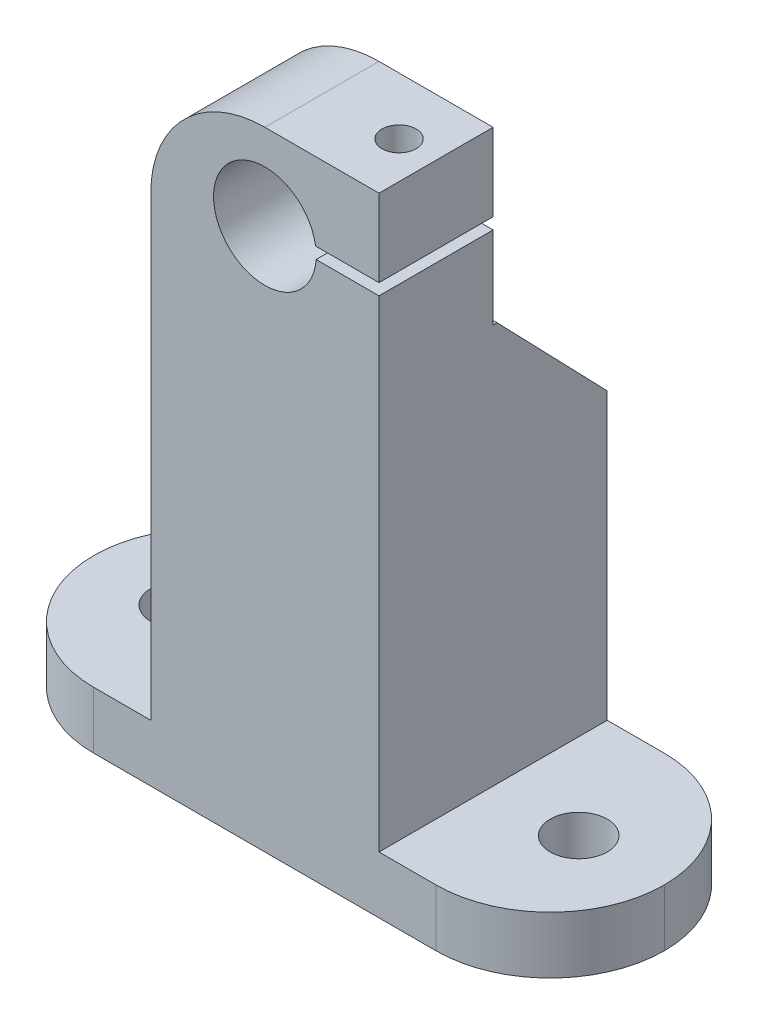
ISO-10303-21;
HEADER;
FILE_DESCRIPTION(('STEP AP214'),'2;1');
FILE_NAME('part.step','',(''),(''),'','','');
FILE_SCHEMA(('AUTOMOTIVE_DESIGN { 1 0 10303 214 1 1 1 1 }'));
ENDSEC;
DATA;
#1=APPLICATION_CONTEXT('core data for automotive mechanical design processes');
#2=APPLICATION_PROTOCOL_DEFINITION('international standard','automotive_design',2000,#1);
#3=PRODUCT_CONTEXT('',#1,'mechanical');
#4=PRODUCT('Part','Part','',(#3));
#5=PRODUCT_RELATED_PRODUCT_CATEGORY('part','',(#4));
#6=PRODUCT_DEFINITION_FORMATION('','',#4);
#7=PRODUCT_DEFINITION_CONTEXT('part definition',#1,'design');
#8=PRODUCT_DEFINITION('design','',#6,#7);
#9=PRODUCT_DEFINITION_SHAPE('','',#8);
#10=(LENGTH_UNIT() NAMED_UNIT(*) SI_UNIT(.MILLI.,.METRE.));
#11=(NAMED_UNIT(*) PLANE_ANGLE_UNIT() SI_UNIT($,.RADIAN.));
#12=(NAMED_UNIT(*) SI_UNIT($,.STERADIAN.) SOLID_ANGLE_UNIT());
#13=UNCERTAINTY_MEASURE_WITH_UNIT(LENGTH_MEASURE(1.E-05),#10,'distance_accuracy_value','');
#14=(GEOMETRIC_REPRESENTATION_CONTEXT(3) GLOBAL_UNCERTAINTY_ASSIGNED_CONTEXT((#13)) GLOBAL_UNIT_ASSIGNED_CONTEXT((#10,
#11,#12)) REPRESENTATION_CONTEXT('',''));
#15=CARTESIAN_POINT('',(0.,0.,0.));
#16=DIRECTION('',(0.,0.,1.));
#17=DIRECTION('',(1.,0.,0.));
#18=AXIS2_PLACEMENT_3D('',#15,#16,#17);
#19=CARTESIAN_POINT('',(0.,0.,20.));
#20=DIRECTION('',(1.,0.,0.));
#21=DIRECTION('',(0.,1.,0.));
#22=AXIS2_PLACEMENT_3D('',#19,#20,#21);
#23=PLANE('',#22);
#24=DIRECTION('',(0.,0.,-1.));
#25=VECTOR('',#24,1.);
#26=CARTESIAN_POINT('',(0.,0.,20.));
#27=LINE('',#26,#25);
#28=CARTESIAN_POINT('',(0.,0.,10.));
#29=VERTEX_POINT('',#28);
#30=CARTESIAN_POINT('',(0.,0.,9.65688774807073));
#31=VERTEX_POINT('',#30);
#32=EDGE_CURVE('E270',#29,#31,#27,.T.);
#33=ORIENTED_EDGE('',*,*,#32,.T.);
#34=DIRECTION('',(0.,0.719339800338652,0.694658370458996));
#35=VECTOR('',#34,1.);
#36=CARTESIAN_POINT('',(0.,0.,9.65688774807073));
#37=LINE('',#36,#35);
#38=CARTESIAN_POINT('',(0.,-10.,0.));
#39=VERTEX_POINT('',#38);
#40=EDGE_CURVE('E67',#31,#39,#37,.F.);
#41=ORIENTED_EDGE('',*,*,#40,.T.);
#42=DIRECTION('',(0.,-1.,0.));
#43=VECTOR('',#42,1.);
#44=CARTESIAN_POINT('',(0.,0.,0.));
#45=LINE('',#44,#43);
#46=CARTESIAN_POINT('',(0.,-35.,0.));
#47=VERTEX_POINT('',#46);
#48=EDGE_CURVE('E193',#39,#47,#45,.T.);
#49=ORIENTED_EDGE('',*,*,#48,.T.);
#50=DIRECTION('',(0.,0.,-1.));
#51=VECTOR('',#50,1.);
#52=CARTESIAN_POINT('',(0.,-35.,20.));
#53=LINE('',#52,#51);
#54=CARTESIAN_POINT('',(0.,-35.,20.));
#55=VERTEX_POINT('',#54);
#56=EDGE_CURVE('E186',#55,#47,#53,.T.);
#57=ORIENTED_EDGE('',*,*,#56,.F.);
#58=DIRECTION('',(0.,-1.,0.));
#59=VECTOR('',#58,1.);
#60=CARTESIAN_POINT('',(0.,0.,20.));
#61=LINE('',#60,#59);
#62=CARTESIAN_POINT('',(0.,5.,20.));
#63=VERTEX_POINT('',#62);
#64=EDGE_CURVE('E169',#63,#55,#61,.T.);
#65=ORIENTED_EDGE('',*,*,#64,.F.);
#66=DIRECTION('',(0.,0.,1.));
#67=VECTOR('',#66,1.);
#68=CARTESIAN_POINT('',(0.,5.,20.));
#69=LINE('',#68,#67);
#70=CARTESIAN_POINT('',(0.,5.,10.));
#71=VERTEX_POINT('',#70);
#72=EDGE_CURVE('E297',#63,#71,#69,.F.);
#73=ORIENTED_EDGE('',*,*,#72,.T.);
#74=DIRECTION('',(0.,1.,0.));
#75=VECTOR('',#74,1.);
#76=CARTESIAN_POINT('',(0.,0.,10.));
#77=LINE('',#76,#75);
#78=EDGE_CURVE('E222',#29,#71,#77,.T.);
#79=ORIENTED_EDGE('',*,*,#78,.F.);
#80=EDGE_LOOP('',(#33,#41,#49,#57,#65,#73,#79));
#81=FACE_BOUND('',#80,.T.);
#82=ADVANCED_FACE('F43',(#81),#23,.F.);
#83=CARTESIAN_POINT('',(20.,0.,20.));
#84=DIRECTION('',(-1.,0.,0.));
#85=DIRECTION('',(0.,0.,1.));
#86=AXIS2_PLACEMENT_3D('',#83,#84,#85);
#87=PLANE('',#86);
#88=DIRECTION('',(0.,1.,0.));
#89=VECTOR('',#88,1.);
#90=CARTESIAN_POINT('',(20.,0.,0.));
#91=LINE('',#90,#89);
#92=CARTESIAN_POINT('',(20.,-35.,0.));
#93=VERTEX_POINT('',#92);
#94=CARTESIAN_POINT('',(20.,-10.,0.));
#95=VERTEX_POINT('',#94);
#96=EDGE_CURVE('E180',#93,#95,#91,.T.);
#97=ORIENTED_EDGE('',*,*,#96,.T.);
#98=DIRECTION('',(0.,-0.719339800338652,-0.694658370458996));
#99=VECTOR('',#98,1.);
#100=CARTESIAN_POINT('',(20.,0.,9.65688774807073));
#101=LINE('',#100,#99);
#102=CARTESIAN_POINT('',(20.,0.,9.65688774807073));
#103=VERTEX_POINT('',#102);
#104=EDGE_CURVE('E11',#95,#103,#101,.F.);
#105=ORIENTED_EDGE('',*,*,#104,.T.);
#106=DIRECTION('',(0.,0.,-1.));
#107=VECTOR('',#106,1.);
#108=CARTESIAN_POINT('',(20.,0.,20.));
#109=LINE('',#108,#107);
#110=CARTESIAN_POINT('',(20.,0.,10.));
#111=VERTEX_POINT('',#110);
#112=EDGE_CURVE('E281',#111,#103,#109,.T.);
#113=ORIENTED_EDGE('',*,*,#112,.F.);
#114=DIRECTION('',(0.,1.,0.));
#115=VECTOR('',#114,1.);
#116=CARTESIAN_POINT('',(20.,0.,10.));
#117=LINE('',#116,#115);
#118=CARTESIAN_POINT('',(20.,7.21054120360455,10.));
#119=VERTEX_POINT('',#118);
#120=EDGE_CURVE('E219',#111,#119,#117,.T.);
#121=ORIENTED_EDGE('',*,*,#120,.T.);
#122=DIRECTION('',(0.,0.,1.));
#123=VECTOR('',#122,1.);
#124=CARTESIAN_POINT('',(20.,7.21054120360455,10.));
#125=LINE('',#124,#123);
#126=CARTESIAN_POINT('',(20.,7.21054120360455,20.));
#127=VERTEX_POINT('',#126);
#128=EDGE_CURVE('E250',#119,#127,#125,.T.);
#129=ORIENTED_EDGE('',*,*,#128,.T.);
#130=DIRECTION('',(0.,1.,0.));
#131=VECTOR('',#130,1.);
#132=CARTESIAN_POINT('',(20.,0.,20.));
#133=LINE('',#132,#131);
#134=CARTESIAN_POINT('',(20.,-35.,20.));
#135=VERTEX_POINT('',#134);
#136=EDGE_CURVE('E267',#135,#127,#133,.T.);
#137=ORIENTED_EDGE('',*,*,#136,.F.);
#138=DIRECTION('',(0.,0.,1.));
#139=VECTOR('',#138,1.);
#140=CARTESIAN_POINT('',(20.,-35.,20.));
#141=LINE('',#140,#139);
#142=EDGE_CURVE('E197',#93,#135,#141,.T.);
#143=ORIENTED_EDGE('',*,*,#142,.F.);
#144=EDGE_LOOP('',(#97,#105,#113,#121,#129,#137,#143));
#145=FACE_BOUND('',#144,.T.);
#146=ADVANCED_FACE('F361',(#145),#87,.F.);
#147=CARTESIAN_POINT('',(0.,0.,20.));
#148=DIRECTION('',(0.,-1.,0.));
#149=DIRECTION('',(0.,0.,-1.));
#150=AXIS2_PLACEMENT_3D('',#147,#148,#149);
#151=PLANE('',#150);
#152=ORIENTED_EDGE('',*,*,#112,.T.);
#153=DIRECTION('',(-1.,0.,0.));
#154=VECTOR('',#153,1.);
#155=CARTESIAN_POINT('',(0.,0.,9.65688774807073));
#156=LINE('',#155,#154);
#157=EDGE_CURVE('E340',#103,#31,#156,.T.);
#158=ORIENTED_EDGE('',*,*,#157,.T.);
#159=ORIENTED_EDGE('',*,*,#32,.F.);
#160=DIRECTION('',(-1.,0.,0.));
#161=VECTOR('',#160,1.);
#162=CARTESIAN_POINT('',(0.,0.,10.));
#163=LINE('',#162,#161);
#164=EDGE_CURVE('E226',#111,#29,#163,.T.);
#165=ORIENTED_EDGE('',*,*,#164,.F.);
#166=EDGE_LOOP('',(#152,#158,#159,#165));
#167=FACE_BOUND('',#166,.T.);
#168=ADVANCED_FACE('F432',(#167),#151,.F.);
#169=CARTESIAN_POINT('',(0.,-40.,20.));
#170=DIRECTION('',(0.,1.,0.));
#171=DIRECTION('',(0.,0.,1.));
#172=AXIS2_PLACEMENT_3D('',#169,#170,#171);
#173=PLANE('',#172);
#174=CARTESIAN_POINT('',(-4.99999999999999,-40.,10.));
#175=DIRECTION('',(0.,1.,0.));
#176=DIRECTION('',(0.,0.,1.));
#177=AXIS2_PLACEMENT_3D('',#174,#175,#176);
#178=CIRCLE('',#177,10.);
#179=CARTESIAN_POINT('',(-4.99999999999999,-40.,20.));
#180=VERTEX_POINT('',#179);
#181=CARTESIAN_POINT('',(-15.,-40.,10.));
#182=VERTEX_POINT('',#181);
#183=EDGE_CURVE('E309',#180,#182,#178,.F.);
#184=ORIENTED_EDGE('',*,*,#183,.T.);
#185=CARTESIAN_POINT('',(-4.99999999999999,-40.,10.));
#186=DIRECTION('',(0.,1.,0.));
#187=DIRECTION('',(0.,0.,1.));
#188=AXIS2_PLACEMENT_3D('',#185,#186,#187);
#189=CIRCLE('',#188,10.);
#190=CARTESIAN_POINT('',(-4.99999999999999,-40.,0.));
#191=VERTEX_POINT('',#190);
#192=EDGE_CURVE('E312',#182,#191,#189,.F.);
#193=ORIENTED_EDGE('',*,*,#192,.T.);
#194=DIRECTION('',(1.,0.,0.));
#195=VECTOR('',#194,1.);
#196=CARTESIAN_POINT('',(0.,-40.,0.));
#197=LINE('',#196,#195);
#198=CARTESIAN_POINT('',(25.,-40.,0.));
#199=VERTEX_POINT('',#198);
#200=EDGE_CURVE('E273',#191,#199,#197,.T.);
#201=ORIENTED_EDGE('',*,*,#200,.T.);
#202=CARTESIAN_POINT('',(25.,-40.,10.));
#203=DIRECTION('',(0.,1.,0.));
#204=DIRECTION('',(0.,0.,1.));
#205=AXIS2_PLACEMENT_3D('',#202,#203,#204);
#206=CIRCLE('',#205,10.);
#207=CARTESIAN_POINT('',(35.,-40.,10.));
#208=VERTEX_POINT('',#207);
#209=EDGE_CURVE('E303',#199,#208,#206,.F.);
#210=ORIENTED_EDGE('',*,*,#209,.T.);
#211=CARTESIAN_POINT('',(25.,-40.,10.));
#212=DIRECTION('',(0.,1.,0.));
#213=DIRECTION('',(0.,0.,1.));
#214=AXIS2_PLACEMENT_3D('',#211,#212,#213);
#215=CIRCLE('',#214,10.);
#216=CARTESIAN_POINT('',(25.,-40.,20.));
#217=VERTEX_POINT('',#216);
#218=EDGE_CURVE('E306',#208,#217,#215,.F.);
#219=ORIENTED_EDGE('',*,*,#218,.T.);
#220=DIRECTION('',(1.,0.,0.));
#221=VECTOR('',#220,1.);
#222=CARTESIAN_POINT('',(0.,-40.,20.));
#223=LINE('',#222,#221);
#224=EDGE_CURVE('E179',#180,#217,#223,.T.);
#225=ORIENTED_EDGE('',*,*,#224,.F.);
#226=EDGE_LOOP('',(#184,#193,#201,#210,#219,#225));
#227=FACE_BOUND('',#226,.T.);
#228=CARTESIAN_POINT('',(27.5,-40.,10.));
#229=DIRECTION('',(0.,-1.,0.));
#230=DIRECTION('',(0.,0.,-1.));
#231=AXIS2_PLACEMENT_3D('',#228,#229,#230);
#232=CIRCLE('',#231,2.5);
#233=CARTESIAN_POINT('',(27.5,-40.,7.5));
#234=VERTEX_POINT('',#233);
#235=EDGE_CURVE('E394',#234,#234,#232,.T.);
#236=ORIENTED_EDGE('',*,*,#235,.F.);
#237=EDGE_LOOP('',(#236));
#238=FACE_BOUND('',#237,.T.);
#239=CARTESIAN_POINT('',(-7.49999999999999,-40.,10.));
#240=DIRECTION('',(0.,-1.,0.));
#241=DIRECTION('',(0.,0.,-1.));
#242=AXIS2_PLACEMENT_3D('',#239,#240,#241);
#243=CIRCLE('',#242,2.5);
#244=CARTESIAN_POINT('',(-7.49999999999999,-40.,7.5));
#245=VERTEX_POINT('',#244);
#246=EDGE_CURVE('E386',#245,#245,#243,.T.);
#247=ORIENTED_EDGE('',*,*,#246,.F.);
#248=EDGE_LOOP('',(#247));
#249=FACE_BOUND('',#248,.T.);
#250=ADVANCED_FACE('F436',(#227,#238,#249),#173,.F.);
#251=CARTESIAN_POINT('',(0.,0.,20.));
#252=DIRECTION('',(0.,0.,1.));
#253=DIRECTION('',(1.,0.,0.));
#254=AXIS2_PLACEMENT_3D('',#251,#252,#253);
#255=PLANE('',#254);
#256=DIRECTION('',(-1.,0.,0.));
#257=VECTOR('',#256,1.);
#258=CARTESIAN_POINT('',(-15.,-35.,20.));
#259=LINE('',#258,#257);
#260=CARTESIAN_POINT('',(-5.,-35.,20.));
#261=VERTEX_POINT('',#260);
#262=EDGE_CURVE('E172',#55,#261,#259,.T.);
#263=ORIENTED_EDGE('',*,*,#262,.T.);
#264=DIRECTION('',(0.,-1.,0.));
#265=VECTOR('',#264,1.);
#266=CARTESIAN_POINT('',(-4.99999999999999,0.,20.));
#267=LINE('',#266,#265);
#268=EDGE_CURVE('E331',#261,#180,#267,.T.);
#269=ORIENTED_EDGE('',*,*,#268,.T.);
#270=ORIENTED_EDGE('',*,*,#224,.T.);
#271=DIRECTION('',(0.,-1.,0.));
#272=VECTOR('',#271,1.);
#273=CARTESIAN_POINT('',(25.,0.,20.));
#274=LINE('',#273,#272);
#275=CARTESIAN_POINT('',(25.,-35.,20.));
#276=VERTEX_POINT('',#275);
#277=EDGE_CURVE('E327',#217,#276,#274,.F.);
#278=ORIENTED_EDGE('',*,*,#277,.T.);
#279=EDGE_CURVE('E190',#276,#135,#259,.T.);
#280=ORIENTED_EDGE('',*,*,#279,.T.);
#281=ORIENTED_EDGE('',*,*,#136,.T.);
#282=DIRECTION('',(-1.,0.,0.));
#283=VECTOR('',#282,1.);
#284=CARTESIAN_POINT('',(0.,7.21054120360455,20.));
#285=LINE('',#284,#283);
#286=CARTESIAN_POINT('',(14.4906807507536,7.21054120360455,20.));
#287=VERTEX_POINT('',#286);
#288=EDGE_CURVE('E211',#127,#287,#285,.T.);
#289=ORIENTED_EDGE('',*,*,#288,.T.);
#290=CARTESIAN_POINT('',(10.,7.5,20.));
#291=DIRECTION('',(0.,0.,1.));
#292=DIRECTION('',(1.,0.,0.));
#293=AXIS2_PLACEMENT_3D('',#290,#291,#292);
#294=CIRCLE('',#293,4.5);
#295=CARTESIAN_POINT('',(14.4435493918691,8.21054120360455,20.));
#296=VERTEX_POINT('',#295);
#297=EDGE_CURVE('E196',#296,#287,#294,.T.);
#298=ORIENTED_EDGE('',*,*,#297,.F.);
#299=DIRECTION('',(-1.,0.,0.));
#300=VECTOR('',#299,1.);
#301=CARTESIAN_POINT('',(0.,8.21054120360455,20.));
#302=LINE('',#301,#300);
#303=CARTESIAN_POINT('',(20.,8.21054120360455,20.));
#304=VERTEX_POINT('',#303);
#305=EDGE_CURVE('E202',#304,#296,#302,.T.);
#306=ORIENTED_EDGE('',*,*,#305,.F.);
#307=DIRECTION('',(0.,1.,0.));
#308=VECTOR('',#307,1.);
#309=CARTESIAN_POINT('',(20.,0.,20.));
#310=LINE('',#309,#308);
#311=CARTESIAN_POINT('',(20.,15.,20.));
#312=VERTEX_POINT('',#311);
#313=EDGE_CURVE('E237',#304,#312,#310,.T.);
#314=ORIENTED_EDGE('',*,*,#313,.T.);
#315=DIRECTION('',(1.,0.,0.));
#316=VECTOR('',#315,1.);
#317=CARTESIAN_POINT('',(0.,15.,20.));
#318=LINE('',#317,#316);
#319=CARTESIAN_POINT('',(10.,15.,20.));
#320=VERTEX_POINT('',#319);
#321=EDGE_CURVE('E241',#320,#312,#318,.T.);
#322=ORIENTED_EDGE('',*,*,#321,.F.);
#323=CARTESIAN_POINT('',(10.,5.,20.));
#324=DIRECTION('',(0.,0.,1.));
#325=DIRECTION('',(1.,0.,0.));
#326=AXIS2_PLACEMENT_3D('',#323,#324,#325);
#327=CIRCLE('',#326,10.);
#328=EDGE_CURVE('E175',#320,#63,#327,.T.);
#329=ORIENTED_EDGE('',*,*,#328,.T.);
#330=ORIENTED_EDGE('',*,*,#64,.T.);
#331=EDGE_LOOP('',(#263,#269,#270,#278,#280,#281,#289,#298,#306,#314,#322,#329,#330));
#332=FACE_BOUND('',#331,.T.);
#333=ADVANCED_FACE('F171',(#332),#255,.T.);
#334=CARTESIAN_POINT('',(0.,0.,0.));
#335=DIRECTION('',(0.,0.,1.));
#336=DIRECTION('',(1.,0.,0.));
#337=AXIS2_PLACEMENT_3D('',#334,#335,#336);
#338=PLANE('',#337);
#339=ORIENTED_EDGE('',*,*,#48,.F.);
#340=DIRECTION('',(1.,0.,0.));
#341=VECTOR('',#340,1.);
#342=CARTESIAN_POINT('',(0.,-10.,0.));
#343=LINE('',#342,#341);
#344=EDGE_CURVE('E53',#39,#95,#343,.T.);
#345=ORIENTED_EDGE('',*,*,#344,.T.);
#346=ORIENTED_EDGE('',*,*,#96,.F.);
#347=DIRECTION('',(1.,0.,0.));
#348=VECTOR('',#347,1.);
#349=CARTESIAN_POINT('',(-15.,-35.,0.));
#350=LINE('',#349,#348);
#351=CARTESIAN_POINT('',(25.,-35.,0.));
#352=VERTEX_POINT('',#351);
#353=EDGE_CURVE('E377',#93,#352,#350,.T.);
#354=ORIENTED_EDGE('',*,*,#353,.T.);
#355=DIRECTION('',(0.,-1.,0.));
#356=VECTOR('',#355,1.);
#357=CARTESIAN_POINT('',(25.,-40.,0.));
#358=LINE('',#357,#356);
#359=EDGE_CURVE('E315',#352,#199,#358,.T.);
#360=ORIENTED_EDGE('',*,*,#359,.T.);
#361=ORIENTED_EDGE('',*,*,#200,.F.);
#362=DIRECTION('',(0.,-1.,0.));
#363=VECTOR('',#362,1.);
#364=CARTESIAN_POINT('',(-4.99999999999999,-35.,0.));
#365=LINE('',#364,#363);
#366=CARTESIAN_POINT('',(-5.,-35.,0.));
#367=VERTEX_POINT('',#366);
#368=EDGE_CURVE('E318',#191,#367,#365,.F.);
#369=ORIENTED_EDGE('',*,*,#368,.T.);
#370=EDGE_CURVE('E191',#367,#47,#350,.T.);
#371=ORIENTED_EDGE('',*,*,#370,.T.);
#372=EDGE_LOOP('',(#339,#345,#346,#354,#360,#361,#369,#371));
#373=FACE_BOUND('',#372,.T.);
#374=ADVANCED_FACE('F459',(#373),#338,.F.);
#375=CARTESIAN_POINT('',(10.,7.5,10.));
#376=DIRECTION('',(0.,0.,1.));
#377=DIRECTION('',(1.,0.,0.));
#378=AXIS2_PLACEMENT_3D('',#375,#376,#377);
#379=CYLINDRICAL_SURFACE('',#378,4.5);
#380=ORIENTED_EDGE('',*,*,#297,.T.);
#381=DIRECTION('',(0.,0.,1.));
#382=VECTOR('',#381,1.);
#383=CARTESIAN_POINT('',(14.4906807507536,7.21054120360455,10.));
#384=LINE('',#383,#382);
#385=CARTESIAN_POINT('',(14.4906807507536,7.21054120360455,10.));
#386=VERTEX_POINT('',#385);
#387=EDGE_CURVE('E247',#386,#287,#384,.T.);
#388=ORIENTED_EDGE('',*,*,#387,.F.);
#389=CARTESIAN_POINT('',(10.,7.5,10.));
#390=DIRECTION('',(0.,0.,1.));
#391=DIRECTION('',(1.,0.,0.));
#392=AXIS2_PLACEMENT_3D('',#389,#390,#391);
#393=CIRCLE('',#392,4.5);
#394=CARTESIAN_POINT('',(14.4435493918691,8.21054120360455,10.));
#395=VERTEX_POINT('',#394);
#396=EDGE_CURVE('E207',#395,#386,#393,.T.);
#397=ORIENTED_EDGE('',*,*,#396,.F.);
#398=DIRECTION('',(0.,0.,1.));
#399=VECTOR('',#398,1.);
#400=CARTESIAN_POINT('',(14.4435493918691,8.21054120360455,10.));
#401=LINE('',#400,#399);
#402=EDGE_CURVE('E233',#395,#296,#401,.T.);
#403=ORIENTED_EDGE('',*,*,#402,.T.);
#404=EDGE_LOOP('',(#380,#388,#397,#403));
#405=FACE_BOUND('',#404,.T.);
#406=ADVANCED_FACE('F489',(#405),#379,.F.);
#407=CARTESIAN_POINT('',(0.,7.21054120360455,10.));
#408=DIRECTION('',(0.,1.,0.));
#409=DIRECTION('',(-1.,0.,0.));
#410=AXIS2_PLACEMENT_3D('',#407,#408,#409);
#411=PLANE('',#410);
#412=CARTESIAN_POINT('',(16.7577527435306,7.21054120360454,15.));
#413=DIRECTION('',(0.,1.,0.));
#414=DIRECTION('',(-1.,0.,0.));
#415=AXIS2_PLACEMENT_3D('',#412,#413,#414);
#416=CIRCLE('',#415,1.5);
#417=CARTESIAN_POINT('',(15.2577527435306,7.21054120360454,15.));
#418=VERTEX_POINT('',#417);
#419=EDGE_CURVE('E290',#418,#418,#416,.T.);
#420=ORIENTED_EDGE('',*,*,#419,.F.);
#421=EDGE_LOOP('',(#420));
#422=FACE_BOUND('',#421,.T.);
#423=ORIENTED_EDGE('',*,*,#288,.F.);
#424=ORIENTED_EDGE('',*,*,#128,.F.);
#425=DIRECTION('',(-1.,0.,0.));
#426=VECTOR('',#425,1.);
#427=CARTESIAN_POINT('',(0.,7.21054120360455,10.));
#428=LINE('',#427,#426);
#429=EDGE_CURVE('E230',#119,#386,#428,.T.);
#430=ORIENTED_EDGE('',*,*,#429,.T.);
#431=ORIENTED_EDGE('',*,*,#387,.T.);
#432=EDGE_LOOP('',(#423,#424,#430,#431));
#433=FACE_BOUND('',#432,.T.);
#434=ADVANCED_FACE('F369',(#422,#433),#411,.T.);
#435=CARTESIAN_POINT('',(0.,15.,10.));
#436=DIRECTION('',(0.,-1.,0.));
#437=DIRECTION('',(0.,0.,-1.));
#438=AXIS2_PLACEMENT_3D('',#435,#436,#437);
#439=PLANE('',#438);
#440=CARTESIAN_POINT('',(16.7577527435306,15.,15.));
#441=DIRECTION('',(0.,1.,0.));
#442=DIRECTION('',(0.,0.,1.));
#443=AXIS2_PLACEMENT_3D('',#440,#441,#442);
#444=CIRCLE('',#443,1.5);
#445=CARTESIAN_POINT('',(16.7577527435306,15.,16.5));
#446=VERTEX_POINT('',#445);
#447=EDGE_CURVE('E345',#446,#446,#444,.T.);
#448=ORIENTED_EDGE('',*,*,#447,.F.);
#449=EDGE_LOOP('',(#448));
#450=FACE_BOUND('',#449,.T.);
#451=DIRECTION('',(1.,0.,0.));
#452=VECTOR('',#451,1.);
#453=CARTESIAN_POINT('',(0.,15.,10.));
#454=LINE('',#453,#452);
#455=CARTESIAN_POINT('',(10.,15.,10.));
#456=VERTEX_POINT('',#455);
#457=CARTESIAN_POINT('',(20.,15.,10.));
#458=VERTEX_POINT('',#457);
#459=EDGE_CURVE('E218',#456,#458,#454,.T.);
#460=ORIENTED_EDGE('',*,*,#459,.F.);
#461=DIRECTION('',(0.,0.,1.));
#462=VECTOR('',#461,1.);
#463=CARTESIAN_POINT('',(10.,15.,10.));
#464=LINE('',#463,#462);
#465=EDGE_CURVE('E285',#456,#320,#464,.T.);
#466=ORIENTED_EDGE('',*,*,#465,.T.);
#467=ORIENTED_EDGE('',*,*,#321,.T.);
#468=DIRECTION('',(0.,0.,1.));
#469=VECTOR('',#468,1.);
#470=CARTESIAN_POINT('',(20.,15.,10.));
#471=LINE('',#470,#469);
#472=EDGE_CURVE('E254',#458,#312,#471,.T.);
#473=ORIENTED_EDGE('',*,*,#472,.F.);
#474=EDGE_LOOP('',(#460,#466,#467,#473));
#475=FACE_BOUND('',#474,.T.);
#476=ADVANCED_FACE('F480',(#450,#475),#439,.F.);
#477=CARTESIAN_POINT('',(20.,0.,10.));
#478=DIRECTION('',(1.,0.,0.));
#479=DIRECTION('',(0.,1.,0.));
#480=AXIS2_PLACEMENT_3D('',#477,#478,#479);
#481=PLANE('',#480);
#482=ORIENTED_EDGE('',*,*,#313,.F.);
#483=DIRECTION('',(0.,0.,1.));
#484=VECTOR('',#483,1.);
#485=CARTESIAN_POINT('',(20.,8.21054120360455,10.));
#486=LINE('',#485,#484);
#487=CARTESIAN_POINT('',(20.,8.21054120360455,10.));
#488=VERTEX_POINT('',#487);
#489=EDGE_CURVE('E258',#488,#304,#486,.T.);
#490=ORIENTED_EDGE('',*,*,#489,.F.);
#491=EDGE_CURVE('E214',#488,#458,#117,.T.);
#492=ORIENTED_EDGE('',*,*,#491,.T.);
#493=ORIENTED_EDGE('',*,*,#472,.T.);
#494=EDGE_LOOP('',(#482,#490,#492,#493));
#495=FACE_BOUND('',#494,.T.);
#496=ADVANCED_FACE('F483',(#495),#481,.T.);
#497=CARTESIAN_POINT('',(0.,8.21054120360455,10.));
#498=DIRECTION('',(0.,1.,0.));
#499=DIRECTION('',(0.,0.,1.));
#500=AXIS2_PLACEMENT_3D('',#497,#498,#499);
#501=PLANE('',#500);
#502=CARTESIAN_POINT('',(16.7577527435306,8.21054120360454,15.));
#503=DIRECTION('',(0.,1.,0.));
#504=DIRECTION('',(0.,0.,1.));
#505=AXIS2_PLACEMENT_3D('',#502,#503,#504);
#506=CIRCLE('',#505,1.5);
#507=CARTESIAN_POINT('',(16.7577527435306,8.21054120360454,16.5));
#508=VERTEX_POINT('',#507);
#509=EDGE_CURVE('E286',#508,#508,#506,.T.);
#510=ORIENTED_EDGE('',*,*,#509,.T.);
#511=EDGE_LOOP('',(#510));
#512=FACE_BOUND('',#511,.T.);
#513=ORIENTED_EDGE('',*,*,#305,.T.);
#514=ORIENTED_EDGE('',*,*,#402,.F.);
#515=DIRECTION('',(-1.,0.,0.));
#516=VECTOR('',#515,1.);
#517=CARTESIAN_POINT('',(0.,8.21054120360455,10.));
#518=LINE('',#517,#516);
#519=EDGE_CURVE('E210',#488,#395,#518,.T.);
#520=ORIENTED_EDGE('',*,*,#519,.F.);
#521=ORIENTED_EDGE('',*,*,#489,.T.);
#522=EDGE_LOOP('',(#513,#514,#520,#521));
#523=FACE_BOUND('',#522,.T.);
#524=ADVANCED_FACE('F487',(#512,#523),#501,.F.);
#525=CARTESIAN_POINT('',(0.,0.,10.));
#526=DIRECTION('',(0.,0.,1.));
#527=DIRECTION('',(1.,0.,0.));
#528=AXIS2_PLACEMENT_3D('',#525,#526,#527);
#529=PLANE('',#528);
#530=ORIENTED_EDGE('',*,*,#78,.T.);
#531=CARTESIAN_POINT('',(10.,5.,10.));
#532=DIRECTION('',(0.,0.,1.));
#533=DIRECTION('',(1.,0.,0.));
#534=AXIS2_PLACEMENT_3D('',#531,#532,#533);
#535=CIRCLE('',#534,10.);
#536=EDGE_CURVE('E300',#71,#456,#535,.F.);
#537=ORIENTED_EDGE('',*,*,#536,.T.);
#538=ORIENTED_EDGE('',*,*,#459,.T.);
#539=ORIENTED_EDGE('',*,*,#491,.F.);
#540=ORIENTED_EDGE('',*,*,#519,.T.);
#541=ORIENTED_EDGE('',*,*,#396,.T.);
#542=ORIENTED_EDGE('',*,*,#429,.F.);
#543=ORIENTED_EDGE('',*,*,#120,.F.);
#544=ORIENTED_EDGE('',*,*,#164,.T.);
#545=EDGE_LOOP('',(#530,#537,#538,#539,#540,#541,#542,#543,#544));
#546=FACE_BOUND('',#545,.T.);
#547=ADVANCED_FACE('F365',(#546),#529,.F.);
#548=CARTESIAN_POINT('',(27.5,-35.,10.));
#549=DIRECTION('',(0.,-1.,0.));
#550=DIRECTION('',(0.,0.,-1.));
#551=AXIS2_PLACEMENT_3D('',#548,#549,#550);
#552=CYLINDRICAL_SURFACE('',#551,2.5);
#553=CARTESIAN_POINT('',(27.5,-35.,10.));
#554=DIRECTION('',(0.,-1.,0.));
#555=DIRECTION('',(0.,0.,-1.));
#556=AXIS2_PLACEMENT_3D('',#553,#554,#555);
#557=CIRCLE('',#556,2.5);
#558=CARTESIAN_POINT('',(27.5,-35.,7.5));
#559=VERTEX_POINT('',#558);
#560=EDGE_CURVE('E392',#559,#559,#557,.T.);
#561=ORIENTED_EDGE('',*,*,#560,.F.);
#562=EDGE_LOOP('',(#561));
#563=FACE_BOUND('',#562,.T.);
#564=ORIENTED_EDGE('',*,*,#235,.T.);
#565=EDGE_LOOP('',(#564));
#566=FACE_BOUND('',#565,.T.);
#567=ADVANCED_FACE('F566',(#563,#566),#552,.F.);
#568=CARTESIAN_POINT('',(0.,-35.,0.));
#569=DIRECTION('',(0.,-1.,0.));
#570=DIRECTION('',(0.,0.,-1.));
#571=AXIS2_PLACEMENT_3D('',#568,#569,#570);
#572=PLANE('',#571);
#573=ORIENTED_EDGE('',*,*,#560,.T.);
#574=EDGE_LOOP('',(#573));
#575=FACE_BOUND('',#574,.T.);
#576=ORIENTED_EDGE('',*,*,#279,.F.);
#577=CARTESIAN_POINT('',(25.,-35.,10.));
#578=DIRECTION('',(0.,-1.,0.));
#579=DIRECTION('',(0.,0.,-1.));
#580=AXIS2_PLACEMENT_3D('',#577,#578,#579);
#581=CIRCLE('',#580,10.);
#582=CARTESIAN_POINT('',(35.,-35.,10.));
#583=VERTEX_POINT('',#582);
#584=EDGE_CURVE('E337',#276,#583,#581,.F.);
#585=ORIENTED_EDGE('',*,*,#584,.T.);
#586=CARTESIAN_POINT('',(25.,-35.,10.));
#587=DIRECTION('',(0.,-1.,0.));
#588=DIRECTION('',(0.,0.,-1.));
#589=AXIS2_PLACEMENT_3D('',#586,#587,#588);
#590=CIRCLE('',#589,10.);
#591=EDGE_CURVE('E334',#583,#352,#590,.F.);
#592=ORIENTED_EDGE('',*,*,#591,.T.);
#593=ORIENTED_EDGE('',*,*,#353,.F.);
#594=ORIENTED_EDGE('',*,*,#142,.T.);
#595=EDGE_LOOP('',(#576,#585,#592,#593,#594));
#596=FACE_BOUND('',#595,.T.);
#597=ADVANCED_FACE('F375',(#575,#596),#572,.F.);
#598=CARTESIAN_POINT('',(-7.49999999999999,-35.,10.));
#599=DIRECTION('',(0.,-1.,0.));
#600=DIRECTION('',(0.,0.,-1.));
#601=AXIS2_PLACEMENT_3D('',#598,#599,#600);
#602=CIRCLE('',#601,2.5);
#603=CARTESIAN_POINT('',(-7.49999999999999,-35.,7.5));
#604=VERTEX_POINT('',#603);
#605=EDGE_CURVE('E381',#604,#604,#602,.T.);
#606=ORIENTED_EDGE('',*,*,#605,.T.);
#607=EDGE_LOOP('',(#606));
#608=FACE_BOUND('',#607,.T.);
#609=ORIENTED_EDGE('',*,*,#370,.F.);
#610=CARTESIAN_POINT('',(-4.99999999999999,-35.,10.));
#611=DIRECTION('',(0.,-1.,0.));
#612=DIRECTION('',(0.,0.,-1.));
#613=AXIS2_PLACEMENT_3D('',#610,#611,#612);
#614=CIRCLE('',#613,10.);
#615=CARTESIAN_POINT('',(-15.,-35.,10.));
#616=VERTEX_POINT('',#615);
#617=EDGE_CURVE('E324',#367,#616,#614,.F.);
#618=ORIENTED_EDGE('',*,*,#617,.T.);
#619=CARTESIAN_POINT('',(-4.99999999999999,-35.,10.));
#620=DIRECTION('',(0.,-1.,0.));
#621=DIRECTION('',(0.,0.,-1.));
#622=AXIS2_PLACEMENT_3D('',#619,#620,#621);
#623=CIRCLE('',#622,10.);
#624=EDGE_CURVE('E188',#616,#261,#623,.F.);
#625=ORIENTED_EDGE('',*,*,#624,.T.);
#626=ORIENTED_EDGE('',*,*,#262,.F.);
#627=ORIENTED_EDGE('',*,*,#56,.T.);
#628=EDGE_LOOP('',(#609,#618,#625,#626,#627));
#629=FACE_BOUND('',#628,.T.);
#630=ADVANCED_FACE('F185',(#608,#629),#572,.F.);
#631=CARTESIAN_POINT('',(-7.49999999999999,-35.,10.));
#632=DIRECTION('',(0.,-1.,0.));
#633=DIRECTION('',(0.,0.,-1.));
#634=AXIS2_PLACEMENT_3D('',#631,#632,#633);
#635=CYLINDRICAL_SURFACE('',#634,2.5);
#636=ORIENTED_EDGE('',*,*,#605,.F.);
#637=EDGE_LOOP('',(#636));
#638=FACE_BOUND('',#637,.T.);
#639=ORIENTED_EDGE('',*,*,#246,.T.);
#640=EDGE_LOOP('',(#639));
#641=FACE_BOUND('',#640,.T.);
#642=ADVANCED_FACE('F424',(#638,#641),#635,.F.);
#643=CARTESIAN_POINT('',(16.7577527435306,-25.,15.));
#644=DIRECTION('',(0.,1.,0.));
#645=DIRECTION('',(0.,0.,1.));
#646=AXIS2_PLACEMENT_3D('',#643,#644,#645);
#647=CYLINDRICAL_SURFACE('',#646,1.5);
#648=ORIENTED_EDGE('',*,*,#447,.T.);
#649=EDGE_LOOP('',(#648));
#650=FACE_BOUND('',#649,.T.);
#651=ORIENTED_EDGE('',*,*,#509,.F.);
#652=EDGE_LOOP('',(#651));
#653=FACE_BOUND('',#652,.T.);
#654=ADVANCED_FACE('F415',(#650,#653),#647,.F.);
#655=ORIENTED_EDGE('',*,*,#419,.T.);
#656=EDGE_LOOP('',(#655));
#657=FACE_BOUND('',#656,.T.);
#658=CARTESIAN_POINT('',(16.7577527435306,-25.,15.));
#659=DIRECTION('',(0.,1.,0.));
#660=DIRECTION('',(0.,0.,1.));
#661=AXIS2_PLACEMENT_3D('',#658,#659,#660);
#662=CIRCLE('',#661,1.5);
#663=CARTESIAN_POINT('',(16.7577527435306,-25.,16.5));
#664=VERTEX_POINT('',#663);
#665=EDGE_CURVE('E291',#664,#664,#662,.T.);
#666=ORIENTED_EDGE('',*,*,#665,.F.);
#667=EDGE_LOOP('',(#666));
#668=FACE_BOUND('',#667,.T.);
#669=ADVANCED_FACE('F413',(#657,#668),#647,.F.);
#670=CARTESIAN_POINT('',(16.7577527435306,-25.,15.));
#671=DIRECTION('',(0.,1.,0.));
#672=DIRECTION('',(0.,0.,1.));
#673=AXIS2_PLACEMENT_3D('',#670,#671,#672);
#674=PLANE('',#673);
#675=ORIENTED_EDGE('',*,*,#665,.T.);
#676=EDGE_LOOP('',(#675));
#677=FACE_BOUND('',#676,.T.);
#678=ADVANCED_FACE('F411',(#677),#674,.T.);
#679=CARTESIAN_POINT('',(10.,5.,10.));
#680=DIRECTION('',(0.,0.,1.));
#681=DIRECTION('',(1.,0.,0.));
#682=AXIS2_PLACEMENT_3D('',#679,#680,#681);
#683=CYLINDRICAL_SURFACE('',#682,10.);
#684=ORIENTED_EDGE('',*,*,#536,.F.);
#685=ORIENTED_EDGE('',*,*,#72,.F.);
#686=ORIENTED_EDGE('',*,*,#328,.F.);
#687=ORIENTED_EDGE('',*,*,#465,.F.);
#688=EDGE_LOOP('',(#684,#685,#686,#687));
#689=FACE_BOUND('',#688,.T.);
#690=ADVANCED_FACE('F422',(#689),#683,.T.);
#691=CARTESIAN_POINT('',(-4.99999999999999,0.,10.));
#692=DIRECTION('',(0.,-1.,0.));
#693=DIRECTION('',(0.,0.,-1.));
#694=AXIS2_PLACEMENT_3D('',#691,#692,#693);
#695=CYLINDRICAL_SURFACE('',#694,10.);
#696=ORIENTED_EDGE('',*,*,#268,.F.);
#697=ORIENTED_EDGE('',*,*,#624,.F.);
#698=DIRECTION('',(0.,-1.,0.));
#699=VECTOR('',#698,1.);
#700=CARTESIAN_POINT('',(-15.,-35.,10.));
#701=LINE('',#700,#699);
#702=EDGE_CURVE('E341',#182,#616,#701,.F.);
#703=ORIENTED_EDGE('',*,*,#702,.F.);
#704=ORIENTED_EDGE('',*,*,#183,.F.);
#705=EDGE_LOOP('',(#696,#697,#703,#704));
#706=FACE_BOUND('',#705,.T.);
#707=ADVANCED_FACE('F439',(#706),#695,.T.);
#708=CARTESIAN_POINT('',(-4.99999999999999,-35.,10.));
#709=DIRECTION('',(0.,1.,0.));
#710=DIRECTION('',(0.,0.,1.));
#711=AXIS2_PLACEMENT_3D('',#708,#709,#710);
#712=CYLINDRICAL_SURFACE('',#711,10.);
#713=ORIENTED_EDGE('',*,*,#617,.F.);
#714=ORIENTED_EDGE('',*,*,#368,.F.);
#715=ORIENTED_EDGE('',*,*,#192,.F.);
#716=ORIENTED_EDGE('',*,*,#702,.T.);
#717=EDGE_LOOP('',(#713,#714,#715,#716));
#718=FACE_BOUND('',#717,.T.);
#719=ADVANCED_FACE('F441',(#718),#712,.T.);
#720=CARTESIAN_POINT('',(25.,0.,10.));
#721=DIRECTION('',(0.,1.,0.));
#722=DIRECTION('',(0.,0.,1.));
#723=AXIS2_PLACEMENT_3D('',#720,#721,#722);
#724=CYLINDRICAL_SURFACE('',#723,10.);
#725=ORIENTED_EDGE('',*,*,#359,.F.);
#726=ORIENTED_EDGE('',*,*,#591,.F.);
#727=DIRECTION('',(0.,-1.,0.));
#728=VECTOR('',#727,1.);
#729=CARTESIAN_POINT('',(35.,-35.,10.));
#730=LINE('',#729,#728);
#731=EDGE_CURVE('E346',#208,#583,#730,.F.);
#732=ORIENTED_EDGE('',*,*,#731,.F.);
#733=ORIENTED_EDGE('',*,*,#209,.F.);
#734=EDGE_LOOP('',(#725,#726,#732,#733));
#735=FACE_BOUND('',#734,.T.);
#736=ADVANCED_FACE('F444',(#735),#724,.T.);
#737=CARTESIAN_POINT('',(25.,-35.,10.));
#738=DIRECTION('',(0.,-1.,0.));
#739=DIRECTION('',(0.,0.,-1.));
#740=AXIS2_PLACEMENT_3D('',#737,#738,#739);
#741=CYLINDRICAL_SURFACE('',#740,10.);
#742=ORIENTED_EDGE('',*,*,#584,.F.);
#743=ORIENTED_EDGE('',*,*,#277,.F.);
#744=ORIENTED_EDGE('',*,*,#218,.F.);
#745=ORIENTED_EDGE('',*,*,#731,.T.);
#746=EDGE_LOOP('',(#742,#743,#744,#745));
#747=FACE_BOUND('',#746,.T.);
#748=ADVANCED_FACE('F449',(#747),#741,.T.);
#749=CARTESIAN_POINT('',(0.,0.,9.65688774807073));
#750=DIRECTION('',(0.,-0.694658370458996,0.719339800338652));
#751=DIRECTION('',(-1.,0.,0.));
#752=AXIS2_PLACEMENT_3D('',#749,#750,#751);
#753=PLANE('',#752);
#754=ORIENTED_EDGE('',*,*,#104,.F.);
#755=ORIENTED_EDGE('',*,*,#344,.F.);
#756=ORIENTED_EDGE('',*,*,#40,.F.);
#757=ORIENTED_EDGE('',*,*,#157,.F.);
#758=EDGE_LOOP('',(#754,#755,#756,#757));
#759=FACE_BOUND('',#758,.T.);
#760=ADVANCED_FACE('F46',(#759),#753,.F.);
#761=CLOSED_SHELL('',(#82,#146,#168,#250,#333,#374,#406,#434,#476,#496,#524,#547,#567,#597,#630,
#642,#654,#669,#678,#690,#707,#719,#736,#748,#760));
#762=MANIFOLD_SOLID_BREP('B2',#761);
#763=ADVANCED_BREP_SHAPE_REPRESENTATION('',(#18,#762),#14);
#764=SHAPE_DEFINITION_REPRESENTATION(#9,#763);
ENDSEC;
END-ISO-10303-21;
